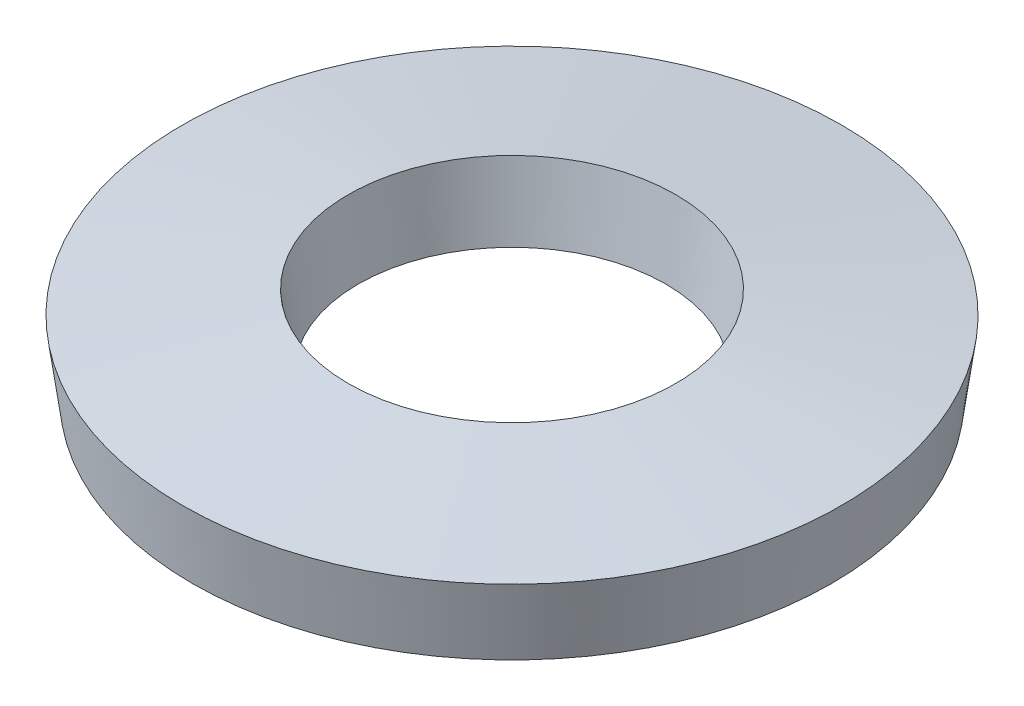
ISO-10303-21;
HEADER;
FILE_DESCRIPTION(('STEP AP214'),'2;1');
FILE_NAME('part.step','',(''),(''),'','','');
FILE_SCHEMA(('AUTOMOTIVE_DESIGN { 1 0 10303 214 1 1 1 1 }'));
ENDSEC;
DATA;
#1=APPLICATION_CONTEXT('core data for automotive mechanical design processes');
#2=APPLICATION_PROTOCOL_DEFINITION('international standard','automotive_design',2000,#1);
#3=PRODUCT_CONTEXT('',#1,'mechanical');
#4=PRODUCT('Part','Part','',(#3));
#5=PRODUCT_RELATED_PRODUCT_CATEGORY('part','',(#4));
#6=PRODUCT_DEFINITION_FORMATION('','',#4);
#7=PRODUCT_DEFINITION_CONTEXT('part definition',#1,'design');
#8=PRODUCT_DEFINITION('design','',#6,#7);
#9=PRODUCT_DEFINITION_SHAPE('','',#8);
#10=(LENGTH_UNIT() NAMED_UNIT(*) SI_UNIT(.MILLI.,.METRE.));
#11=(NAMED_UNIT(*) PLANE_ANGLE_UNIT() SI_UNIT($,.RADIAN.));
#12=(NAMED_UNIT(*) SI_UNIT($,.STERADIAN.) SOLID_ANGLE_UNIT());
#13=UNCERTAINTY_MEASURE_WITH_UNIT(LENGTH_MEASURE(1.E-05),#10,'distance_accuracy_value','');
#14=(GEOMETRIC_REPRESENTATION_CONTEXT(3) GLOBAL_UNCERTAINTY_ASSIGNED_CONTEXT((#13)) GLOBAL_UNIT_ASSIGNED_CONTEXT((#10,
#11,#12)) REPRESENTATION_CONTEXT('',''));
#15=CARTESIAN_POINT('',(0.,0.,0.));
#16=DIRECTION('',(0.,0.,1.));
#17=DIRECTION('',(1.,0.,0.));
#18=AXIS2_PLACEMENT_3D('',#15,#16,#17);
#19=CARTESIAN_POINT('',(0.,0.,0.));
#20=DIRECTION('',(0.,1.,0.));
#21=DIRECTION('',(0.,0.,1.));
#22=AXIS2_PLACEMENT_3D('',#19,#20,#21);
#23=CONICAL_SURFACE('',#22,8.72946063611701,0.135685641043847);
#24=CARTESIAN_POINT('',(0.,1.98161763531459,0.));
#25=DIRECTION('',(0.,-1.,0.));
#26=DIRECTION('',(0.,0.,-1.));
#27=AXIS2_PLACEMENT_3D('',#24,#25,#26);
#28=CIRCLE('',#27,9.);
#29=CARTESIAN_POINT('',(0.,1.98161763531459,-9.));
#30=VERTEX_POINT('',#29);
#31=EDGE_CURVE('E10',#30,#30,#28,.T.);
#32=ORIENTED_EDGE('',*,*,#31,.T.);
#33=EDGE_LOOP('',(#32));
#34=FACE_BOUND('',#33,.T.);
#35=CARTESIAN_POINT('',(0.,0.,0.));
#36=DIRECTION('',(0.,-1.,0.));
#37=DIRECTION('',(0.,0.,-1.));
#38=AXIS2_PLACEMENT_3D('',#35,#36,#37);
#39=CIRCLE('',#38,8.72946063611701);
#40=CARTESIAN_POINT('',(0.,0.,-8.72946063611701));
#41=VERTEX_POINT('',#40);
#42=EDGE_CURVE('E54',#41,#41,#39,.T.);
#43=ORIENTED_EDGE('',*,*,#42,.F.);
#44=EDGE_LOOP('',(#43));
#45=FACE_BOUND('',#44,.T.);
#46=ADVANCED_FACE('F40',(#34,#45),#23,.T.);
#47=CARTESIAN_POINT('',(0.,1.98161763531459,0.));
#48=DIRECTION('',(0.,-1.,0.));
#49=DIRECTION('',(0.,0.,-1.));
#50=AXIS2_PLACEMENT_3D('',#47,#48,#49);
#51=CONICAL_SURFACE('',#50,9.,1.43511068575105);
#52=CARTESIAN_POINT('',(0.,2.6,0.));
#53=DIRECTION('',(0.,-1.,0.));
#54=DIRECTION('',(0.,0.,-1.));
#55=AXIS2_PLACEMENT_3D('',#52,#53,#54);
#56=CIRCLE('',#55,4.47053936388299);
#57=CARTESIAN_POINT('',(0.,2.6,-4.47053936388299));
#58=VERTEX_POINT('',#57);
#59=EDGE_CURVE('E46',#58,#58,#56,.T.);
#60=ORIENTED_EDGE('',*,*,#59,.T.);
#61=EDGE_LOOP('',(#60));
#62=FACE_BOUND('',#61,.T.);
#63=ORIENTED_EDGE('',*,*,#31,.F.);
#64=EDGE_LOOP('',(#63));
#65=FACE_BOUND('',#64,.T.);
#66=ADVANCED_FACE('F64',(#62,#65),#51,.T.);
#67=CARTESIAN_POINT('',(0.,2.6,0.));
#68=DIRECTION('',(0.,1.,0.));
#69=DIRECTION('',(0.,0.,1.));
#70=AXIS2_PLACEMENT_3D('',#67,#68,#69);
#71=CONICAL_SURFACE('',#70,4.47053936388299,0.135685641043846);
#72=CARTESIAN_POINT('',(0.,0.618382364685408,0.));
#73=DIRECTION('',(0.,-1.,0.));
#74=DIRECTION('',(0.,0.,-1.));
#75=AXIS2_PLACEMENT_3D('',#72,#73,#74);
#76=CIRCLE('',#75,4.2);
#77=CARTESIAN_POINT('',(0.,0.618382364685408,-4.2));
#78=VERTEX_POINT('',#77);
#79=EDGE_CURVE('E50',#78,#78,#76,.T.);
#80=ORIENTED_EDGE('',*,*,#79,.T.);
#81=EDGE_LOOP('',(#80));
#82=FACE_BOUND('',#81,.T.);
#83=ORIENTED_EDGE('',*,*,#59,.F.);
#84=EDGE_LOOP('',(#83));
#85=FACE_BOUND('',#84,.T.);
#86=ADVANCED_FACE('F68',(#82,#85),#71,.F.);
#87=CARTESIAN_POINT('',(0.,0.618382364685408,0.));
#88=DIRECTION('',(0.,-1.,0.));
#89=DIRECTION('',(0.,0.,-1.));
#90=AXIS2_PLACEMENT_3D('',#87,#88,#89);
#91=CONICAL_SURFACE('',#90,4.2,1.43511068575105);
#92=ORIENTED_EDGE('',*,*,#42,.T.);
#93=EDGE_LOOP('',(#92));
#94=FACE_BOUND('',#93,.T.);
#95=ORIENTED_EDGE('',*,*,#79,.F.);
#96=EDGE_LOOP('',(#95));
#97=FACE_BOUND('',#96,.T.);
#98=ADVANCED_FACE('F60',(#94,#97),#91,.F.);
#99=CLOSED_SHELL('',(#46,#66,#86,#98));
#100=MANIFOLD_SOLID_BREP('B2',#99);
#101=ADVANCED_BREP_SHAPE_REPRESENTATION('',(#18,#100),#14);
#102=SHAPE_DEFINITION_REPRESENTATION(#9,#101);
ENDSEC;
END-ISO-10303-21;
